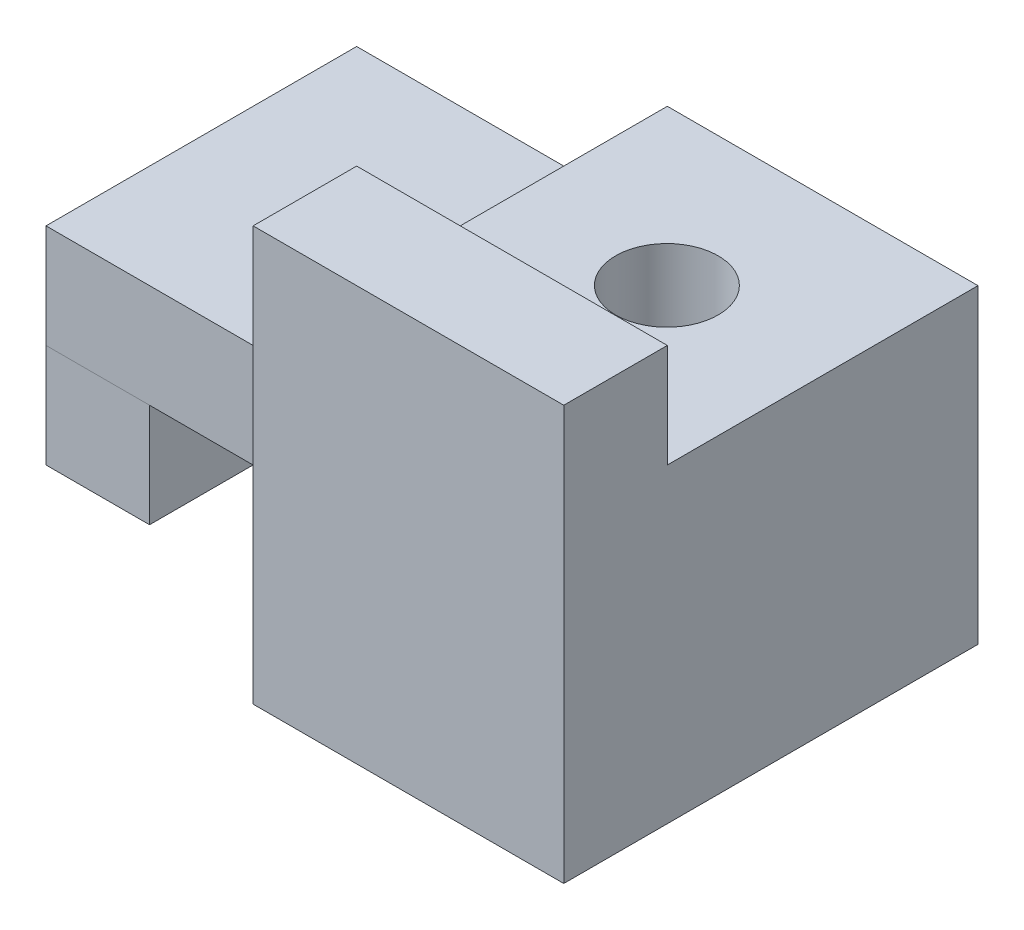
ISO-10303-21;
HEADER;
FILE_DESCRIPTION(('STEP AP214'),'2;1');
FILE_NAME('part.step','',(''),(''),'','','');
FILE_SCHEMA(('AUTOMOTIVE_DESIGN { 1 0 10303 214 1 1 1 1 }'));
ENDSEC;
DATA;
#1=APPLICATION_CONTEXT('core data for automotive mechanical design processes');
#2=APPLICATION_PROTOCOL_DEFINITION('international standard','automotive_design',2000,#1);
#3=PRODUCT_CONTEXT('',#1,'mechanical');
#4=PRODUCT('Part','Part','',(#3));
#5=PRODUCT_RELATED_PRODUCT_CATEGORY('part','',(#4));
#6=PRODUCT_DEFINITION_FORMATION('','',#4);
#7=PRODUCT_DEFINITION_CONTEXT('part definition',#1,'design');
#8=PRODUCT_DEFINITION('design','',#6,#7);
#9=PRODUCT_DEFINITION_SHAPE('','',#8);
#10=(LENGTH_UNIT() NAMED_UNIT(*) SI_UNIT(.MILLI.,.METRE.));
#11=(NAMED_UNIT(*) PLANE_ANGLE_UNIT() SI_UNIT($,.RADIAN.));
#12=(NAMED_UNIT(*) SI_UNIT($,.STERADIAN.) SOLID_ANGLE_UNIT());
#13=UNCERTAINTY_MEASURE_WITH_UNIT(LENGTH_MEASURE(1.E-05),#10,'distance_accuracy_value','');
#14=(GEOMETRIC_REPRESENTATION_CONTEXT(3) GLOBAL_UNCERTAINTY_ASSIGNED_CONTEXT((#13)) GLOBAL_UNIT_ASSIGNED_CONTEXT((#10,
#11,#12)) REPRESENTATION_CONTEXT('',''));
#15=CARTESIAN_POINT('',(0.,0.,0.));
#16=DIRECTION('',(0.,0.,1.));
#17=DIRECTION('',(1.,0.,0.));
#18=AXIS2_PLACEMENT_3D('',#15,#16,#17);
#19=CARTESIAN_POINT('',(0.,-25.4,0.));
#20=DIRECTION('',(1.,0.,0.));
#21=DIRECTION('',(0.,0.,-1.));
#22=AXIS2_PLACEMENT_3D('',#19,#20,#21);
#23=PLANE('',#22);
#24=DIRECTION('',(0.,0.,-1.));
#25=VECTOR('',#24,1.);
#26=CARTESIAN_POINT('',(0.,0.,0.));
#27=LINE('',#26,#25);
#28=CARTESIAN_POINT('',(0.,0.,0.));
#29=VERTEX_POINT('',#28);
#30=CARTESIAN_POINT('',(0.,0.,-76.2));
#31=VERTEX_POINT('',#30);
#32=EDGE_CURVE('E118',#29,#31,#27,.T.);
#33=ORIENTED_EDGE('',*,*,#32,.T.);
#34=DIRECTION('',(0.,1.,0.));
#35=VECTOR('',#34,1.);
#36=CARTESIAN_POINT('',(0.,-25.4,-76.2));
#37=LINE('',#36,#35);
#38=CARTESIAN_POINT('',(0.,-25.4,-76.2));
#39=VERTEX_POINT('',#38);
#40=EDGE_CURVE('E12',#39,#31,#37,.T.);
#41=ORIENTED_EDGE('',*,*,#40,.F.);
#42=DIRECTION('',(0.,0.,-1.));
#43=VECTOR('',#42,1.);
#44=CARTESIAN_POINT('',(0.,-25.4,0.));
#45=LINE('',#44,#43);
#46=CARTESIAN_POINT('',(0.,-25.4,0.));
#47=VERTEX_POINT('',#46);
#48=EDGE_CURVE('E106',#47,#39,#45,.T.);
#49=ORIENTED_EDGE('',*,*,#48,.F.);
#50=DIRECTION('',(0.,1.,0.));
#51=VECTOR('',#50,1.);
#52=CARTESIAN_POINT('',(0.,-25.4,0.));
#53=LINE('',#52,#51);
#54=EDGE_CURVE('E114',#47,#29,#53,.T.);
#55=ORIENTED_EDGE('',*,*,#54,.T.);
#56=EDGE_LOOP('',(#33,#41,#49,#55));
#57=FACE_BOUND('',#56,.T.);
#58=ADVANCED_FACE('F55',(#57),#23,.F.);
#59=CARTESIAN_POINT('',(0.,-25.4,-76.2));
#60=DIRECTION('',(0.,0.,1.));
#61=DIRECTION('',(1.,0.,0.));
#62=AXIS2_PLACEMENT_3D('',#59,#60,#61);
#63=PLANE('',#62);
#64=DIRECTION('',(1.,0.,0.));
#65=VECTOR('',#64,1.);
#66=CARTESIAN_POINT('',(0.,0.,-76.2));
#67=LINE('',#66,#65);
#68=CARTESIAN_POINT('',(25.4,0.,-76.2));
#69=VERTEX_POINT('',#68);
#70=EDGE_CURVE('E110',#31,#69,#67,.T.);
#71=ORIENTED_EDGE('',*,*,#70,.T.);
#72=DIRECTION('',(0.,1.,0.));
#73=VECTOR('',#72,1.);
#74=CARTESIAN_POINT('',(25.4,-25.4,-76.2));
#75=LINE('',#74,#73);
#76=CARTESIAN_POINT('',(25.4,-25.4,-76.2));
#77=VERTEX_POINT('',#76);
#78=EDGE_CURVE('E63',#77,#69,#75,.T.);
#79=ORIENTED_EDGE('',*,*,#78,.F.);
#80=DIRECTION('',(1.,0.,0.));
#81=VECTOR('',#80,1.);
#82=CARTESIAN_POINT('',(0.,-25.4,-76.2));
#83=LINE('',#82,#81);
#84=EDGE_CURVE('E101',#39,#77,#83,.T.);
#85=ORIENTED_EDGE('',*,*,#84,.F.);
#86=ORIENTED_EDGE('',*,*,#40,.T.);
#87=EDGE_LOOP('',(#71,#79,#85,#86));
#88=FACE_BOUND('',#87,.T.);
#89=ADVANCED_FACE('F109',(#88),#63,.F.);
#90=CARTESIAN_POINT('',(25.4,-25.4,0.));
#91=DIRECTION('',(-1.,0.,0.));
#92=DIRECTION('',(0.,0.,1.));
#93=AXIS2_PLACEMENT_3D('',#90,#91,#92);
#94=PLANE('',#93);
#95=DIRECTION('',(0.,0.,1.));
#96=VECTOR('',#95,1.);
#97=CARTESIAN_POINT('',(25.4,0.,0.));
#98=LINE('',#97,#96);
#99=CARTESIAN_POINT('',(25.4,0.,0.));
#100=VERTEX_POINT('',#99);
#101=EDGE_CURVE('E88',#69,#100,#98,.T.);
#102=ORIENTED_EDGE('',*,*,#101,.T.);
#103=DIRECTION('',(0.,1.,0.));
#104=VECTOR('',#103,1.);
#105=CARTESIAN_POINT('',(25.4,-25.4,0.));
#106=LINE('',#105,#104);
#107=CARTESIAN_POINT('',(25.4,-25.4,0.));
#108=VERTEX_POINT('',#107);
#109=EDGE_CURVE('E111',#108,#100,#106,.T.);
#110=ORIENTED_EDGE('',*,*,#109,.F.);
#111=DIRECTION('',(0.,0.,1.));
#112=VECTOR('',#111,1.);
#113=CARTESIAN_POINT('',(25.4,-25.4,0.));
#114=LINE('',#113,#112);
#115=EDGE_CURVE('E104',#77,#108,#114,.T.);
#116=ORIENTED_EDGE('',*,*,#115,.F.);
#117=ORIENTED_EDGE('',*,*,#78,.T.);
#118=EDGE_LOOP('',(#102,#110,#116,#117));
#119=FACE_BOUND('',#118,.T.);
#120=ADVANCED_FACE('F112',(#119),#94,.F.);
#121=CARTESIAN_POINT('',(0.,-25.4,0.));
#122=DIRECTION('',(0.,0.,-1.));
#123=DIRECTION('',(-1.,0.,0.));
#124=AXIS2_PLACEMENT_3D('',#121,#122,#123);
#125=PLANE('',#124);
#126=DIRECTION('',(-1.,0.,0.));
#127=VECTOR('',#126,1.);
#128=CARTESIAN_POINT('',(0.,0.,0.));
#129=LINE('',#128,#127);
#130=EDGE_CURVE('E94',#100,#29,#129,.T.);
#131=ORIENTED_EDGE('',*,*,#130,.T.);
#132=ORIENTED_EDGE('',*,*,#54,.F.);
#133=DIRECTION('',(-1.,0.,0.));
#134=VECTOR('',#133,1.);
#135=CARTESIAN_POINT('',(0.,-25.4,0.));
#136=LINE('',#135,#134);
#137=EDGE_CURVE('E71',#108,#47,#136,.T.);
#138=ORIENTED_EDGE('',*,*,#137,.F.);
#139=ORIENTED_EDGE('',*,*,#109,.T.);
#140=EDGE_LOOP('',(#131,#132,#138,#139));
#141=FACE_BOUND('',#140,.T.);
#142=ADVANCED_FACE('F125',(#141),#125,.F.);
#143=CARTESIAN_POINT('',(0.,-25.4,0.));
#144=DIRECTION('',(0.,-1.,0.));
#145=DIRECTION('',(0.,0.,-1.));
#146=AXIS2_PLACEMENT_3D('',#143,#144,#145);
#147=PLANE('',#146);
#148=ORIENTED_EDGE('',*,*,#48,.T.);
#149=ORIENTED_EDGE('',*,*,#84,.T.);
#150=ORIENTED_EDGE('',*,*,#115,.T.);
#151=ORIENTED_EDGE('',*,*,#137,.T.);
#152=EDGE_LOOP('',(#148,#149,#150,#151));
#153=FACE_BOUND('',#152,.T.);
#154=ADVANCED_FACE('F102',(#153),#147,.T.);
#155=CARTESIAN_POINT('',(0.,0.,0.));
#156=DIRECTION('',(0.,-1.,0.));
#157=DIRECTION('',(0.,0.,-1.));
#158=AXIS2_PLACEMENT_3D('',#155,#156,#157);
#159=PLANE('',#158);
#160=ORIENTED_EDGE('',*,*,#32,.F.);
#161=ORIENTED_EDGE('',*,*,#130,.F.);
#162=ORIENTED_EDGE('',*,*,#101,.F.);
#163=ORIENTED_EDGE('',*,*,#70,.F.);
#164=EDGE_LOOP('',(#160,#161,#162,#163));
#165=FACE_BOUND('',#164,.T.);
#166=ADVANCED_FACE('F128',(#165),#159,.F.);
#167=CLOSED_SHELL('',(#58,#89,#120,#142,#154,#166));
#168=MANIFOLD_SOLID_BREP('B2',#167);
#169=CARTESIAN_POINT('',(76.2,25.4,0.));
#170=DIRECTION('',(0.,0.,-1.));
#171=DIRECTION('',(-1.,0.,0.));
#172=AXIS2_PLACEMENT_3D('',#169,#170,#171);
#173=PLANE('',#172);
#174=DIRECTION('',(1.,0.,0.));
#175=VECTOR('',#174,1.);
#176=CARTESIAN_POINT('',(76.2,0.,0.));
#177=LINE('',#176,#175);
#178=CARTESIAN_POINT('',(0.,0.,0.));
#179=VERTEX_POINT('',#178);
#180=CARTESIAN_POINT('',(76.2,0.,0.));
#181=VERTEX_POINT('',#180);
#182=EDGE_CURVE('E335',#179,#181,#177,.T.);
#183=ORIENTED_EDGE('',*,*,#182,.T.);
#184=DIRECTION('',(0.,-1.,0.));
#185=VECTOR('',#184,1.);
#186=CARTESIAN_POINT('',(76.2,25.4,0.));
#187=LINE('',#186,#185);
#188=CARTESIAN_POINT('',(76.2,25.4,0.));
#189=VERTEX_POINT('',#188);
#190=EDGE_CURVE('E182',#189,#181,#187,.T.);
#191=ORIENTED_EDGE('',*,*,#190,.F.);
#192=DIRECTION('',(1.,0.,0.));
#193=VECTOR('',#192,1.);
#194=CARTESIAN_POINT('',(76.2,25.4,0.));
#195=LINE('',#194,#193);
#196=CARTESIAN_POINT('',(0.,25.4,0.));
#197=VERTEX_POINT('',#196);
#198=EDGE_CURVE('E224',#197,#189,#195,.T.);
#199=ORIENTED_EDGE('',*,*,#198,.F.);
#200=DIRECTION('',(0.,-1.,0.));
#201=VECTOR('',#200,1.);
#202=CARTESIAN_POINT('',(0.,25.4,0.));
#203=LINE('',#202,#201);
#204=EDGE_CURVE('E353',#197,#179,#203,.T.);
#205=ORIENTED_EDGE('',*,*,#204,.T.);
#206=EDGE_LOOP('',(#183,#191,#199,#205));
#207=FACE_BOUND('',#206,.T.);
#208=ADVANCED_FACE('F179',(#207),#173,.F.);
#209=CARTESIAN_POINT('',(0.,25.4,-76.2));
#210=DIRECTION('',(0.,0.,1.));
#211=DIRECTION('',(1.,0.,0.));
#212=AXIS2_PLACEMENT_3D('',#209,#210,#211);
#213=PLANE('',#212);
#214=DIRECTION('',(0.,1.,0.));
#215=VECTOR('',#214,1.);
#216=CARTESIAN_POINT('',(152.4,0.,-76.2));
#217=LINE('',#216,#215);
#218=CARTESIAN_POINT('',(152.4,-25.4,-76.2));
#219=VERTEX_POINT('',#218);
#220=CARTESIAN_POINT('',(152.4,50.8,-76.2));
#221=VERTEX_POINT('',#220);
#222=EDGE_CURVE('E272',#219,#221,#217,.T.);
#223=ORIENTED_EDGE('',*,*,#222,.F.);
#224=DIRECTION('',(1.,0.,0.));
#225=VECTOR('',#224,1.);
#226=CARTESIAN_POINT('',(76.2,-25.4,-76.2));
#227=LINE('',#226,#225);
#228=CARTESIAN_POINT('',(76.2,-25.4,-76.2));
#229=VERTEX_POINT('',#228);
#230=EDGE_CURVE('E265',#229,#219,#227,.T.);
#231=ORIENTED_EDGE('',*,*,#230,.F.);
#232=DIRECTION('',(0.,1.,0.));
#233=VECTOR('',#232,1.);
#234=CARTESIAN_POINT('',(76.2,-25.4,-76.2));
#235=LINE('',#234,#233);
#236=CARTESIAN_POINT('',(76.2,0.,-76.2));
#237=VERTEX_POINT('',#236);
#238=EDGE_CURVE('E269',#229,#237,#235,.T.);
#239=ORIENTED_EDGE('',*,*,#238,.T.);
#240=DIRECTION('',(-1.,0.,0.));
#241=VECTOR('',#240,1.);
#242=CARTESIAN_POINT('',(0.,0.,-76.2));
#243=LINE('',#242,#241);
#244=CARTESIAN_POINT('',(0.,0.,-76.2));
#245=VERTEX_POINT('',#244);
#246=EDGE_CURVE('E357',#237,#245,#243,.T.);
#247=ORIENTED_EDGE('',*,*,#246,.T.);
#248=DIRECTION('',(0.,-1.,0.));
#249=VECTOR('',#248,1.);
#250=CARTESIAN_POINT('',(0.,25.4,-76.2));
#251=LINE('',#250,#249);
#252=CARTESIAN_POINT('',(0.,25.4,-76.2));
#253=VERTEX_POINT('',#252);
#254=EDGE_CURVE('E363',#253,#245,#251,.T.);
#255=ORIENTED_EDGE('',*,*,#254,.F.);
#256=DIRECTION('',(-1.,0.,0.));
#257=VECTOR('',#256,1.);
#258=CARTESIAN_POINT('',(0.,25.4,-76.2));
#259=LINE('',#258,#257);
#260=CARTESIAN_POINT('',(76.2,25.4,-76.2));
#261=VERTEX_POINT('',#260);
#262=EDGE_CURVE('E348',#261,#253,#259,.T.);
#263=ORIENTED_EDGE('',*,*,#262,.F.);
#264=DIRECTION('',(0.,1.,0.));
#265=VECTOR('',#264,1.);
#266=CARTESIAN_POINT('',(76.2,0.,-76.2));
#267=LINE('',#266,#265);
#268=CARTESIAN_POINT('',(76.2,50.8,-76.2));
#269=VERTEX_POINT('',#268);
#270=EDGE_CURVE('E332',#261,#269,#267,.T.);
#271=ORIENTED_EDGE('',*,*,#270,.T.);
#272=DIRECTION('',(-1.,0.,0.));
#273=VECTOR('',#272,1.);
#274=CARTESIAN_POINT('',(76.2,50.8,-76.2));
#275=LINE('',#274,#273);
#276=EDGE_CURVE('E327',#221,#269,#275,.T.);
#277=ORIENTED_EDGE('',*,*,#276,.F.);
#278=EDGE_LOOP('',(#223,#231,#239,#247,#255,#263,#271,#277));
#279=FACE_BOUND('',#278,.T.);
#280=ADVANCED_FACE('F267',(#279),#213,.F.);
#281=CARTESIAN_POINT('',(0.,25.4,0.));
#282=DIRECTION('',(1.,0.,0.));
#283=DIRECTION('',(0.,0.,-1.));
#284=AXIS2_PLACEMENT_3D('',#281,#282,#283);
#285=PLANE('',#284);
#286=DIRECTION('',(0.,0.,1.));
#287=VECTOR('',#286,1.);
#288=CARTESIAN_POINT('',(0.,0.,0.));
#289=LINE('',#288,#287);
#290=EDGE_CURVE('E219',#245,#179,#289,.T.);
#291=ORIENTED_EDGE('',*,*,#290,.T.);
#292=ORIENTED_EDGE('',*,*,#204,.F.);
#293=DIRECTION('',(0.,0.,1.));
#294=VECTOR('',#293,1.);
#295=CARTESIAN_POINT('',(0.,25.4,0.));
#296=LINE('',#295,#294);
#297=EDGE_CURVE('E204',#253,#197,#296,.T.);
#298=ORIENTED_EDGE('',*,*,#297,.F.);
#299=ORIENTED_EDGE('',*,*,#254,.T.);
#300=EDGE_LOOP('',(#291,#292,#298,#299));
#301=FACE_BOUND('',#300,.T.);
#302=ADVANCED_FACE('F373',(#301),#285,.F.);
#303=CARTESIAN_POINT('',(0.,25.4,0.));
#304=DIRECTION('',(0.,-1.,0.));
#305=DIRECTION('',(0.,0.,-1.));
#306=AXIS2_PLACEMENT_3D('',#303,#304,#305);
#307=PLANE('',#306);
#308=CARTESIAN_POINT('',(50.8174189166791,25.4,-37.9919574854994));
#309=DIRECTION('',(0.,1.,0.));
#310=DIRECTION('',(0.,0.,1.));
#311=AXIS2_PLACEMENT_3D('',#308,#309,#310);
#312=CIRCLE('',#311,12.7626681730629);
#313=CARTESIAN_POINT('',(50.8174189166791,25.4,-25.2292893124365));
#314=VERTEX_POINT('',#313);
#315=EDGE_CURVE('E547',#314,#314,#312,.T.);
#316=ORIENTED_EDGE('',*,*,#315,.F.);
#317=EDGE_LOOP('',(#316));
#318=FACE_BOUND('',#317,.T.);
#319=ORIENTED_EDGE('',*,*,#198,.T.);
#320=DIRECTION('',(0.,0.,-1.));
#321=VECTOR('',#320,1.);
#322=CARTESIAN_POINT('',(76.2,25.4,-76.2));
#323=LINE('',#322,#321);
#324=EDGE_CURVE('E345',#189,#261,#323,.T.);
#325=ORIENTED_EDGE('',*,*,#324,.T.);
#326=ORIENTED_EDGE('',*,*,#262,.T.);
#327=ORIENTED_EDGE('',*,*,#297,.T.);
#328=EDGE_LOOP('',(#319,#325,#326,#327));
#329=FACE_BOUND('',#328,.T.);
#330=ADVANCED_FACE('F375',(#318,#329),#307,.F.);
#331=CARTESIAN_POINT('',(0.,0.,0.));
#332=DIRECTION('',(0.,-1.,0.));
#333=DIRECTION('',(0.,0.,-1.));
#334=AXIS2_PLACEMENT_3D('',#331,#332,#333);
#335=PLANE('',#334);
#336=CARTESIAN_POINT('',(50.8174189166791,0.,-37.9919574854994));
#337=DIRECTION('',(0.,1.,0.));
#338=DIRECTION('',(0.,0.,1.));
#339=AXIS2_PLACEMENT_3D('',#336,#337,#338);
#340=CIRCLE('',#339,12.7626681730629);
#341=CARTESIAN_POINT('',(50.8174189166791,0.,-25.2292893124365));
#342=VERTEX_POINT('',#341);
#343=EDGE_CURVE('E543',#342,#342,#340,.T.);
#344=ORIENTED_EDGE('',*,*,#343,.T.);
#345=EDGE_LOOP('',(#344));
#346=FACE_BOUND('',#345,.T.);
#347=DIRECTION('',(0.,0.,-1.));
#348=VECTOR('',#347,1.);
#349=CARTESIAN_POINT('',(76.2,0.,25.4));
#350=LINE('',#349,#348);
#351=EDGE_CURVE('E53',#181,#237,#350,.T.);
#352=ORIENTED_EDGE('',*,*,#351,.F.);
#353=ORIENTED_EDGE('',*,*,#182,.F.);
#354=ORIENTED_EDGE('',*,*,#290,.F.);
#355=ORIENTED_EDGE('',*,*,#246,.F.);
#356=EDGE_LOOP('',(#352,#353,#354,#355));
#357=FACE_BOUND('',#356,.T.);
#358=ADVANCED_FACE('F371',(#346,#357),#335,.T.);
#359=CARTESIAN_POINT('',(76.2,0.,-76.2));
#360=DIRECTION('',(-1.,0.,0.));
#361=DIRECTION('',(0.,0.,1.));
#362=AXIS2_PLACEMENT_3D('',#359,#360,#361);
#363=PLANE('',#362);
#364=ORIENTED_EDGE('',*,*,#324,.F.);
#365=ORIENTED_EDGE('',*,*,#190,.T.);
#366=ORIENTED_EDGE('',*,*,#351,.T.);
#367=ORIENTED_EDGE('',*,*,#238,.F.);
#368=DIRECTION('',(0.,0.,-1.));
#369=VECTOR('',#368,1.);
#370=CARTESIAN_POINT('',(76.2,-25.4,25.4));
#371=LINE('',#370,#369);
#372=CARTESIAN_POINT('',(76.2,-25.4,25.4));
#373=VERTEX_POINT('',#372);
#374=EDGE_CURVE('E278',#373,#229,#371,.T.);
#375=ORIENTED_EDGE('',*,*,#374,.F.);
#376=DIRECTION('',(0.,1.,0.));
#377=VECTOR('',#376,1.);
#378=CARTESIAN_POINT('',(76.2,0.,25.4));
#379=LINE('',#378,#377);
#380=CARTESIAN_POINT('',(76.2,76.2,25.4));
#381=VERTEX_POINT('',#380);
#382=EDGE_CURVE('E331',#373,#381,#379,.T.);
#383=ORIENTED_EDGE('',*,*,#382,.T.);
#384=DIRECTION('',(0.,0.,1.));
#385=VECTOR('',#384,1.);
#386=CARTESIAN_POINT('',(76.2,76.2,25.4));
#387=LINE('',#386,#385);
#388=CARTESIAN_POINT('',(76.2,76.2,0.));
#389=VERTEX_POINT('',#388);
#390=EDGE_CURVE('E296',#389,#381,#387,.T.);
#391=ORIENTED_EDGE('',*,*,#390,.F.);
#392=DIRECTION('',(0.,-1.,0.));
#393=VECTOR('',#392,1.);
#394=CARTESIAN_POINT('',(76.2,76.2,0.));
#395=LINE('',#394,#393);
#396=CARTESIAN_POINT('',(76.2,50.8,0.));
#397=VERTEX_POINT('',#396);
#398=EDGE_CURVE('E312',#389,#397,#395,.T.);
#399=ORIENTED_EDGE('',*,*,#398,.T.);
#400=DIRECTION('',(0.,0.,1.));
#401=VECTOR('',#400,1.);
#402=CARTESIAN_POINT('',(76.2,50.8,-76.2));
#403=LINE('',#402,#401);
#404=EDGE_CURVE('E321',#269,#397,#403,.T.);
#405=ORIENTED_EDGE('',*,*,#404,.F.);
#406=ORIENTED_EDGE('',*,*,#270,.F.);
#407=EDGE_LOOP('',(#364,#365,#366,#367,#375,#383,#391,#399,#405,#406));
#408=FACE_BOUND('',#407,.T.);
#409=ADVANCED_FACE('F290',(#408),#363,.T.);
#410=CARTESIAN_POINT('',(152.4,0.,-76.2));
#411=DIRECTION('',(1.,0.,0.));
#412=DIRECTION('',(0.,0.,-1.));
#413=AXIS2_PLACEMENT_3D('',#410,#411,#412);
#414=PLANE('',#413);
#415=ORIENTED_EDGE('',*,*,#222,.T.);
#416=DIRECTION('',(0.,0.,-1.));
#417=VECTOR('',#416,1.);
#418=CARTESIAN_POINT('',(152.4,50.8,-76.2));
#419=LINE('',#418,#417);
#420=CARTESIAN_POINT('',(152.4,50.8,0.));
#421=VERTEX_POINT('',#420);
#422=EDGE_CURVE('E324',#421,#221,#419,.T.);
#423=ORIENTED_EDGE('',*,*,#422,.F.);
#424=DIRECTION('',(0.,-1.,0.));
#425=VECTOR('',#424,1.);
#426=CARTESIAN_POINT('',(152.4,76.2,0.));
#427=LINE('',#426,#425);
#428=CARTESIAN_POINT('',(152.4,76.2,0.));
#429=VERTEX_POINT('',#428);
#430=EDGE_CURVE('E317',#429,#421,#427,.T.);
#431=ORIENTED_EDGE('',*,*,#430,.F.);
#432=DIRECTION('',(0.,0.,-1.));
#433=VECTOR('',#432,1.);
#434=CARTESIAN_POINT('',(152.4,76.2,25.4));
#435=LINE('',#434,#433);
#436=CARTESIAN_POINT('',(152.4,76.2,25.4));
#437=VERTEX_POINT('',#436);
#438=EDGE_CURVE('E307',#437,#429,#435,.T.);
#439=ORIENTED_EDGE('',*,*,#438,.F.);
#440=DIRECTION('',(0.,1.,0.));
#441=VECTOR('',#440,1.);
#442=CARTESIAN_POINT('',(152.4,0.,25.4));
#443=LINE('',#442,#441);
#444=CARTESIAN_POINT('',(152.4,-25.4,25.4));
#445=VERTEX_POINT('',#444);
#446=EDGE_CURVE('E338',#445,#437,#443,.T.);
#447=ORIENTED_EDGE('',*,*,#446,.F.);
#448=DIRECTION('',(0.,0.,1.));
#449=VECTOR('',#448,1.);
#450=CARTESIAN_POINT('',(152.4,-25.4,25.4));
#451=LINE('',#450,#449);
#452=EDGE_CURVE('E277',#219,#445,#451,.T.);
#453=ORIENTED_EDGE('',*,*,#452,.F.);
#454=EDGE_LOOP('',(#415,#423,#431,#439,#447,#453));
#455=FACE_BOUND('',#454,.T.);
#456=ADVANCED_FACE('F405',(#455),#414,.T.);
#457=CARTESIAN_POINT('',(76.2,0.,25.4));
#458=DIRECTION('',(0.,0.,1.));
#459=DIRECTION('',(1.,0.,0.));
#460=AXIS2_PLACEMENT_3D('',#457,#458,#459);
#461=PLANE('',#460);
#462=ORIENTED_EDGE('',*,*,#446,.T.);
#463=DIRECTION('',(1.,0.,0.));
#464=VECTOR('',#463,1.);
#465=CARTESIAN_POINT('',(76.2,76.2,25.4));
#466=LINE('',#465,#464);
#467=EDGE_CURVE('E303',#381,#437,#466,.T.);
#468=ORIENTED_EDGE('',*,*,#467,.F.);
#469=ORIENTED_EDGE('',*,*,#382,.F.);
#470=DIRECTION('',(-1.,0.,0.));
#471=VECTOR('',#470,1.);
#472=CARTESIAN_POINT('',(76.2,-25.4,25.4));
#473=LINE('',#472,#471);
#474=EDGE_CURVE('E284',#445,#373,#473,.T.);
#475=ORIENTED_EDGE('',*,*,#474,.F.);
#476=EDGE_LOOP('',(#462,#468,#469,#475));
#477=FACE_BOUND('',#476,.T.);
#478=ADVANCED_FACE('F413',(#477),#461,.T.);
#479=CARTESIAN_POINT('',(0.,50.8,0.));
#480=DIRECTION('',(0.,1.,0.));
#481=DIRECTION('',(0.,0.,1.));
#482=AXIS2_PLACEMENT_3D('',#479,#480,#481);
#483=PLANE('',#482);
#484=CARTESIAN_POINT('',(114.191992331164,50.8,-38.1));
#485=DIRECTION('',(0.,1.,0.));
#486=DIRECTION('',(0.,0.,1.));
#487=AXIS2_PLACEMENT_3D('',#484,#485,#486);
#488=CIRCLE('',#487,12.5776476356988);
#489=CARTESIAN_POINT('',(114.191992331164,50.8,-25.5223523643012));
#490=VERTEX_POINT('',#489);
#491=EDGE_CURVE('E539',#490,#490,#488,.T.);
#492=ORIENTED_EDGE('',*,*,#491,.F.);
#493=EDGE_LOOP('',(#492));
#494=FACE_BOUND('',#493,.T.);
#495=DIRECTION('',(-1.,0.,0.));
#496=VECTOR('',#495,1.);
#497=CARTESIAN_POINT('',(76.2,50.8,0.));
#498=LINE('',#497,#496);
#499=EDGE_CURVE('E195',#421,#397,#498,.T.);
#500=ORIENTED_EDGE('',*,*,#499,.F.);
#501=ORIENTED_EDGE('',*,*,#422,.T.);
#502=ORIENTED_EDGE('',*,*,#276,.T.);
#503=ORIENTED_EDGE('',*,*,#404,.T.);
#504=EDGE_LOOP('',(#500,#501,#502,#503));
#505=FACE_BOUND('',#504,.T.);
#506=ADVANCED_FACE('F422',(#494,#505),#483,.T.);
#507=CARTESIAN_POINT('',(76.2,76.2,0.));
#508=DIRECTION('',(0.,0.,1.));
#509=DIRECTION('',(1.,0.,0.));
#510=AXIS2_PLACEMENT_3D('',#507,#508,#509);
#511=PLANE('',#510);
#512=ORIENTED_EDGE('',*,*,#499,.T.);
#513=ORIENTED_EDGE('',*,*,#398,.F.);
#514=DIRECTION('',(-1.,0.,0.));
#515=VECTOR('',#514,1.);
#516=CARTESIAN_POINT('',(76.2,76.2,0.));
#517=LINE('',#516,#515);
#518=EDGE_CURVE('E310',#429,#389,#517,.T.);
#519=ORIENTED_EDGE('',*,*,#518,.F.);
#520=ORIENTED_EDGE('',*,*,#430,.T.);
#521=EDGE_LOOP('',(#512,#513,#519,#520));
#522=FACE_BOUND('',#521,.T.);
#523=ADVANCED_FACE('F432',(#522),#511,.F.);
#524=CARTESIAN_POINT('',(0.,76.2,0.));
#525=DIRECTION('',(0.,-1.,0.));
#526=DIRECTION('',(0.,0.,-1.));
#527=AXIS2_PLACEMENT_3D('',#524,#525,#526);
#528=PLANE('',#527);
#529=ORIENTED_EDGE('',*,*,#390,.T.);
#530=ORIENTED_EDGE('',*,*,#467,.T.);
#531=ORIENTED_EDGE('',*,*,#438,.T.);
#532=ORIENTED_EDGE('',*,*,#518,.T.);
#533=EDGE_LOOP('',(#529,#530,#531,#532));
#534=FACE_BOUND('',#533,.T.);
#535=ADVANCED_FACE('F393',(#534),#528,.F.);
#536=CARTESIAN_POINT('',(0.,-25.4,0.));
#537=DIRECTION('',(0.,-1.,0.));
#538=DIRECTION('',(0.,0.,-1.));
#539=AXIS2_PLACEMENT_3D('',#536,#537,#538);
#540=PLANE('',#539);
#541=CARTESIAN_POINT('',(114.191992331164,-25.4,-38.1));
#542=DIRECTION('',(0.,1.,0.));
#543=DIRECTION('',(0.,0.,1.));
#544=AXIS2_PLACEMENT_3D('',#541,#542,#543);
#545=CIRCLE('',#544,12.5776476356988);
#546=CARTESIAN_POINT('',(114.191992331164,-25.4,-25.5223523643012));
#547=VERTEX_POINT('',#546);
#548=EDGE_CURVE('E287',#547,#547,#545,.T.);
#549=ORIENTED_EDGE('',*,*,#548,.T.);
#550=EDGE_LOOP('',(#549));
#551=FACE_BOUND('',#550,.T.);
#552=ORIENTED_EDGE('',*,*,#374,.T.);
#553=ORIENTED_EDGE('',*,*,#230,.T.);
#554=ORIENTED_EDGE('',*,*,#452,.T.);
#555=ORIENTED_EDGE('',*,*,#474,.T.);
#556=EDGE_LOOP('',(#552,#553,#554,#555));
#557=FACE_BOUND('',#556,.T.);
#558=ADVANCED_FACE('F282',(#551,#557),#540,.T.);
#559=CARTESIAN_POINT('',(114.191992331164,-25.4,-38.1));
#560=DIRECTION('',(0.,1.,0.));
#561=DIRECTION('',(0.,0.,1.));
#562=AXIS2_PLACEMENT_3D('',#559,#560,#561);
#563=CYLINDRICAL_SURFACE('',#562,12.5776476356988);
#564=CARTESIAN_POINT('',(114.191992331164,-25.4,-25.5223523643012));
#565=CARTESIAN_POINT('',(114.191992331164,-24.60625,-25.5223523643012));
#566=CARTESIAN_POINT('',(114.191992331164,-23.8125,-25.5223523643012));
#567=CARTESIAN_POINT('',(114.191992331164,-22.225,-25.5223523643012));
#568=CARTESIAN_POINT('',(114.191992331164,-21.43125,-25.5223523643012));
#569=CARTESIAN_POINT('',(114.191992331164,-19.84375,-25.5223523643012));
#570=CARTESIAN_POINT('',(114.191992331164,-19.05,-25.5223523643012));
#571=CARTESIAN_POINT('',(114.191992331164,-17.4625,-25.5223523643012));
#572=CARTESIAN_POINT('',(114.191992331164,-16.66875,-25.5223523643012));
#573=CARTESIAN_POINT('',(114.191992331164,-15.08125,-25.5223523643012));
#574=CARTESIAN_POINT('',(114.191992331164,-14.2875,-25.5223523643012));
#575=CARTESIAN_POINT('',(114.191992331164,-12.7,-25.5223523643012));
#576=CARTESIAN_POINT('',(114.191992331164,-11.90625,-25.5223523643012));
#577=CARTESIAN_POINT('',(114.191992331164,-10.31875,-25.5223523643012));
#578=CARTESIAN_POINT('',(114.191992331164,-9.52500000000001,-25.5223523643012));
#579=CARTESIAN_POINT('',(114.191992331164,-7.93750000000001,-25.5223523643012));
#580=CARTESIAN_POINT('',(114.191992331164,-7.14375000000001,-25.5223523643012));
#581=CARTESIAN_POINT('',(114.191992331164,-5.55625000000001,-25.5223523643012));
#582=CARTESIAN_POINT('',(114.191992331164,-4.76250000000001,-25.5223523643012));
#583=CARTESIAN_POINT('',(114.191992331164,-3.17500000000001,-25.5223523643012));
#584=CARTESIAN_POINT('',(114.191992331164,-2.38125000000001,-25.5223523643012));
#585=CARTESIAN_POINT('',(114.191992331164,-0.793750000000006,-25.5223523643012));
#586=CARTESIAN_POINT('',(114.191992331164,0.,-25.5223523643012));
#587=CARTESIAN_POINT('',(114.191992331164,1.58749999999999,-25.5223523643012));
#588=CARTESIAN_POINT('',(114.191992331164,2.38124999999999,-25.5223523643012));
#589=CARTESIAN_POINT('',(114.191992331164,3.96874999999999,-25.5223523643012));
#590=CARTESIAN_POINT('',(114.191992331164,4.76249999999999,-25.5223523643012));
#591=CARTESIAN_POINT('',(114.191992331164,6.34999999999999,-25.5223523643012));
#592=CARTESIAN_POINT('',(114.191992331164,7.14374999999999,-25.5223523643012));
#593=CARTESIAN_POINT('',(114.191992331164,8.73124999999999,-25.5223523643012));
#594=CARTESIAN_POINT('',(114.191992331164,9.52499999999999,-25.5223523643012));
#595=CARTESIAN_POINT('',(114.191992331164,11.1125,-25.5223523643012));
#596=CARTESIAN_POINT('',(114.191992331164,11.90625,-25.5223523643012));
#597=CARTESIAN_POINT('',(114.191992331164,13.49375,-25.5223523643012));
#598=CARTESIAN_POINT('',(114.191992331164,14.2875,-25.5223523643012));
#599=CARTESIAN_POINT('',(114.191992331164,15.875,-25.5223523643012));
#600=CARTESIAN_POINT('',(114.191992331164,16.66875,-25.5223523643012));
#601=CARTESIAN_POINT('',(114.191992331164,18.25625,-25.5223523643012));
#602=CARTESIAN_POINT('',(114.191992331164,19.05,-25.5223523643012));
#603=CARTESIAN_POINT('',(114.191992331164,20.6375,-25.5223523643012));
#604=CARTESIAN_POINT('',(114.191992331164,21.43125,-25.5223523643012));
#605=CARTESIAN_POINT('',(114.191992331164,23.01875,-25.5223523643012));
#606=CARTESIAN_POINT('',(114.191992331164,23.8125,-25.5223523643012));
#607=CARTESIAN_POINT('',(114.191992331164,25.4,-25.5223523643012));
#608=CARTESIAN_POINT('',(114.191992331164,26.19375,-25.5223523643012));
#609=CARTESIAN_POINT('',(114.191992331164,27.78125,-25.5223523643012));
#610=CARTESIAN_POINT('',(114.191992331164,28.575,-25.5223523643012));
#611=CARTESIAN_POINT('',(114.191992331164,30.1625,-25.5223523643012));
#612=CARTESIAN_POINT('',(114.191992331164,30.95625,-25.5223523643012));
#613=CARTESIAN_POINT('',(114.191992331164,32.54375,-25.5223523643012));
#614=CARTESIAN_POINT('',(114.191992331164,33.3375,-25.5223523643012));
#615=CARTESIAN_POINT('',(114.191992331164,34.925,-25.5223523643012));
#616=CARTESIAN_POINT('',(114.191992331164,35.71875,-25.5223523643012));
#617=CARTESIAN_POINT('',(114.191992331164,37.30625,-25.5223523643012));
#618=CARTESIAN_POINT('',(114.191992331164,38.1,-25.5223523643012));
#619=CARTESIAN_POINT('',(114.191992331164,39.6875,-25.5223523643012));
#620=CARTESIAN_POINT('',(114.191992331164,40.48125,-25.5223523643012));
#621=CARTESIAN_POINT('',(114.191992331164,42.06875,-25.5223523643012));
#622=CARTESIAN_POINT('',(114.191992331164,42.8625,-25.5223523643012));
#623=CARTESIAN_POINT('',(114.191992331164,44.45,-25.5223523643012));
#624=CARTESIAN_POINT('',(114.191992331164,45.24375,-25.5223523643012));
#625=CARTESIAN_POINT('',(114.191992331164,46.83125,-25.5223523643012));
#626=CARTESIAN_POINT('',(114.191992331164,47.625,-25.5223523643012));
#627=CARTESIAN_POINT('',(114.191992331164,49.2125,-25.5223523643012));
#628=CARTESIAN_POINT('',(114.191992331164,50.00625,-25.5223523643012));
#629=CARTESIAN_POINT('',(114.191992331164,50.8,-25.5223523643012));
#630=B_SPLINE_CURVE_WITH_KNOTS('',3,(#564,#565,#566,#567,#568,#569,#570,#571,#572,#573,#574,
#575,#576,#577,#578,#579,#580,#581,#582,#583,#584,#585,#586,#587,#588,#589,#590,#591,#592,#593,
#594,#595,#596,#597,#598,#599,#600,#601,#602,#603,#604,#605,#606,#607,#608,#609,#610,#611,#612,
#613,#614,#615,#616,#617,#618,#619,#620,#621,#622,#623,#624,#625,#626,#627,#628,#629),
.UNSPECIFIED.,.F.,.F.,(4,2,2,2,2,2,2,2,2,2,2,2,2,2,2,2,2,2,2,2,2,2,2,2,2,2,2,2,2,2,2,2,4),(0.,
2.38125,4.7625,7.14375,9.525,11.90625,14.2875,16.66875,19.05,21.43125,23.8125,26.19375,28.575,
30.95625,33.3375,35.71875,38.1,40.48125,42.8625,45.24375,47.625,50.00625,52.3875,54.76875,57.15,
59.53125,61.9125,64.29375,66.675,69.05625,71.4375,73.81875,76.2),.UNSPECIFIED.);
#631=EDGE_CURVE('BSEAM441',#547,#490,#630,.T.);
#632=ORIENTED_EDGE('',*,*,#548,.F.);
#633=ORIENTED_EDGE('',*,*,#491,.T.);
#634=ORIENTED_EDGE('',*,*,#631,.T.);
#635=ORIENTED_EDGE('',*,*,#631,.F.);
#636=EDGE_LOOP('',(#632,#634,#633,#635));
#637=FACE_BOUND('',#636,.T.);
#638=ADVANCED_FACE('F441',(#637),#563,.F.);
#639=CARTESIAN_POINT('',(50.8174189166791,0.,-37.9919574854994));
#640=DIRECTION('',(0.,1.,0.));
#641=DIRECTION('',(0.,0.,1.));
#642=AXIS2_PLACEMENT_3D('',#639,#640,#641);
#643=CYLINDRICAL_SURFACE('',#642,12.7626681730629);
#644=ORIENTED_EDGE('',*,*,#343,.F.);
#645=EDGE_LOOP('',(#644));
#646=FACE_BOUND('',#645,.T.);
#647=ORIENTED_EDGE('',*,*,#315,.T.);
#648=EDGE_LOOP('',(#647));
#649=FACE_BOUND('',#648,.T.);
#650=ADVANCED_FACE('F449',(#646,#649),#643,.F.);
#651=CLOSED_SHELL('',(#208,#280,#302,#330,#358,#409,#456,#478,#506,#523,#535,#558,#638,#650));
#652=MANIFOLD_SOLID_BREP('B6',#651);
#653=ADVANCED_BREP_SHAPE_REPRESENTATION('',(#18,#168,#652),#14);
#654=SHAPE_DEFINITION_REPRESENTATION(#9,#653);
ENDSEC;
END-ISO-10303-21;
